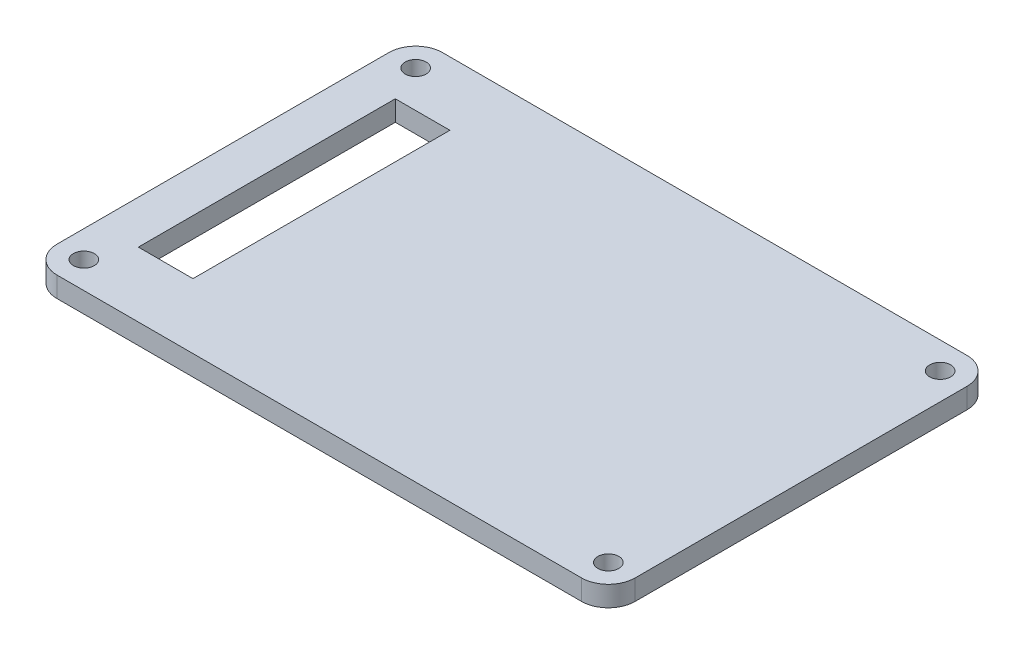
ISO-10303-21;
HEADER;
FILE_DESCRIPTION(('STEP AP214'),'2;1');
FILE_NAME('part.step','',(''),(''),'','','');
FILE_SCHEMA(('AUTOMOTIVE_DESIGN { 1 0 10303 214 1 1 1 1 }'));
ENDSEC;
DATA;
#1=APPLICATION_CONTEXT('core data for automotive mechanical design processes');
#2=APPLICATION_PROTOCOL_DEFINITION('international standard','automotive_design',2000,#1);
#3=PRODUCT_CONTEXT('',#1,'mechanical');
#4=PRODUCT('Part','Part','',(#3));
#5=PRODUCT_RELATED_PRODUCT_CATEGORY('part','',(#4));
#6=PRODUCT_DEFINITION_FORMATION('','',#4);
#7=PRODUCT_DEFINITION_CONTEXT('part definition',#1,'design');
#8=PRODUCT_DEFINITION('design','',#6,#7);
#9=PRODUCT_DEFINITION_SHAPE('','',#8);
#10=(LENGTH_UNIT() NAMED_UNIT(*) SI_UNIT(.MILLI.,.METRE.));
#11=(NAMED_UNIT(*) PLANE_ANGLE_UNIT() SI_UNIT($,.RADIAN.));
#12=(NAMED_UNIT(*) SI_UNIT($,.STERADIAN.) SOLID_ANGLE_UNIT());
#13=UNCERTAINTY_MEASURE_WITH_UNIT(LENGTH_MEASURE(1.E-05),#10,'distance_accuracy_value','');
#14=(GEOMETRIC_REPRESENTATION_CONTEXT(3) GLOBAL_UNCERTAINTY_ASSIGNED_CONTEXT((#13)) GLOBAL_UNIT_ASSIGNED_CONTEXT((#10,
#11,#12)) REPRESENTATION_CONTEXT('',''));
#15=CARTESIAN_POINT('',(0.,0.,0.));
#16=DIRECTION('',(0.,0.,1.));
#17=DIRECTION('',(1.,0.,0.));
#18=AXIS2_PLACEMENT_3D('',#15,#16,#17);
#19=CARTESIAN_POINT('',(-40.825,3.175,-25.825));
#20=DIRECTION('',(0.,1.,0.));
#21=DIRECTION('',(0.,0.,1.));
#22=AXIS2_PLACEMENT_3D('',#19,#20,#21);
#23=PLANE('',#22);
#24=DIRECTION('',(1.,0.,0.));
#25=VECTOR('',#24,1.);
#26=CARTESIAN_POINT('',(-38.2653138076385,3.175,19.9));
#27=LINE('',#26,#25);
#28=CARTESIAN_POINT('',(-38.2653138076385,3.175,19.9));
#29=VERTEX_POINT('',#28);
#30=CARTESIAN_POINT('',(-29.7653138076385,3.175,19.9));
#31=VERTEX_POINT('',#30);
#32=EDGE_CURVE('E48',#29,#31,#27,.T.);
#33=ORIENTED_EDGE('',*,*,#32,.F.);
#34=DIRECTION('',(0.,0.,1.));
#35=VECTOR('',#34,1.);
#36=CARTESIAN_POINT('',(-38.2653138076385,3.175,-20.1));
#37=LINE('',#36,#35);
#38=CARTESIAN_POINT('',(-38.2653138076385,3.175,-20.1));
#39=VERTEX_POINT('',#38);
#40=EDGE_CURVE('E140',#39,#29,#37,.T.);
#41=ORIENTED_EDGE('',*,*,#40,.F.);
#42=DIRECTION('',(-1.,0.,0.));
#43=VECTOR('',#42,1.);
#44=CARTESIAN_POINT('',(-29.7653138076385,3.175,-20.1));
#45=LINE('',#44,#43);
#46=CARTESIAN_POINT('',(-29.7653138076385,3.175,-20.1));
#47=VERTEX_POINT('',#46);
#48=EDGE_CURVE('E143',#47,#39,#45,.T.);
#49=ORIENTED_EDGE('',*,*,#48,.F.);
#50=DIRECTION('',(0.,0.,-1.));
#51=VECTOR('',#50,1.);
#52=CARTESIAN_POINT('',(-29.7653138076385,3.175,19.9));
#53=LINE('',#52,#51);
#54=EDGE_CURVE('E149',#31,#47,#53,.T.);
#55=ORIENTED_EDGE('',*,*,#54,.F.);
#56=EDGE_LOOP('',(#33,#41,#49,#55));
#57=FACE_BOUND('',#56,.T.);
#58=CARTESIAN_POINT('',(-40.825,3.175,-25.825));
#59=DIRECTION('',(0.,1.,0.));
#60=DIRECTION('',(0.,0.,1.));
#61=AXIS2_PLACEMENT_3D('',#58,#59,#60);
#62=CIRCLE('',#61,1.63195);
#63=CARTESIAN_POINT('',(-40.825,3.175,-24.19305));
#64=VERTEX_POINT('',#63);
#65=EDGE_CURVE('E165',#64,#64,#62,.T.);
#66=ORIENTED_EDGE('',*,*,#65,.F.);
#67=EDGE_LOOP('',(#66));
#68=FACE_BOUND('',#67,.T.);
#69=CARTESIAN_POINT('',(40.825,3.175,-25.825));
#70=DIRECTION('',(0.,1.,0.));
#71=DIRECTION('',(0.,0.,1.));
#72=AXIS2_PLACEMENT_3D('',#69,#70,#71);
#73=CIRCLE('',#72,1.63195);
#74=CARTESIAN_POINT('',(40.825,3.175,-24.19305));
#75=VERTEX_POINT('',#74);
#76=EDGE_CURVE('E177',#75,#75,#73,.T.);
#77=ORIENTED_EDGE('',*,*,#76,.F.);
#78=EDGE_LOOP('',(#77));
#79=FACE_BOUND('',#78,.T.);
#80=CARTESIAN_POINT('',(-40.825,3.175,-25.825));
#81=DIRECTION('',(0.,1.,0.));
#82=DIRECTION('',(0.,0.,1.));
#83=AXIS2_PLACEMENT_3D('',#80,#81,#82);
#84=CIRCLE('',#83,4.17499999999999);
#85=CARTESIAN_POINT('',(-40.825,3.175,-30.));
#86=VERTEX_POINT('',#85);
#87=CARTESIAN_POINT('',(-45.,3.175,-25.825));
#88=VERTEX_POINT('',#87);
#89=EDGE_CURVE('E183',#86,#88,#84,.T.);
#90=ORIENTED_EDGE('',*,*,#89,.T.);
#91=DIRECTION('',(0.,0.,1.));
#92=VECTOR('',#91,1.);
#93=CARTESIAN_POINT('',(-45.,3.175,-25.825));
#94=LINE('',#93,#92);
#95=CARTESIAN_POINT('',(-45.,3.175,25.825));
#96=VERTEX_POINT('',#95);
#97=EDGE_CURVE('E186',#88,#96,#94,.T.);
#98=ORIENTED_EDGE('',*,*,#97,.T.);
#99=CARTESIAN_POINT('',(-40.825,3.175,25.825));
#100=DIRECTION('',(0.,1.,0.));
#101=DIRECTION('',(0.,0.,1.));
#102=AXIS2_PLACEMENT_3D('',#99,#100,#101);
#103=CIRCLE('',#102,4.17500000000001);
#104=CARTESIAN_POINT('',(-40.825,3.175,30.));
#105=VERTEX_POINT('',#104);
#106=EDGE_CURVE('E189',#96,#105,#103,.T.);
#107=ORIENTED_EDGE('',*,*,#106,.T.);
#108=DIRECTION('',(1.,0.,0.));
#109=VECTOR('',#108,1.);
#110=CARTESIAN_POINT('',(-40.825,3.175,30.));
#111=LINE('',#110,#109);
#112=CARTESIAN_POINT('',(40.825,3.175,30.));
#113=VERTEX_POINT('',#112);
#114=EDGE_CURVE('E191',#105,#113,#111,.T.);
#115=ORIENTED_EDGE('',*,*,#114,.T.);
#116=CARTESIAN_POINT('',(40.825,3.175,25.825));
#117=DIRECTION('',(0.,1.,0.));
#118=DIRECTION('',(0.,0.,1.));
#119=AXIS2_PLACEMENT_3D('',#116,#117,#118);
#120=CIRCLE('',#119,4.17499999999999);
#121=CARTESIAN_POINT('',(45.,3.175,25.825));
#122=VERTEX_POINT('',#121);
#123=EDGE_CURVE('E193',#113,#122,#120,.T.);
#124=ORIENTED_EDGE('',*,*,#123,.T.);
#125=DIRECTION('',(0.,0.,-1.));
#126=VECTOR('',#125,1.);
#127=CARTESIAN_POINT('',(45.,3.175,-25.825));
#128=LINE('',#127,#126);
#129=CARTESIAN_POINT('',(45.,3.175,-25.825));
#130=VERTEX_POINT('',#129);
#131=EDGE_CURVE('E195',#122,#130,#128,.T.);
#132=ORIENTED_EDGE('',*,*,#131,.T.);
#133=CARTESIAN_POINT('',(40.825,3.175,-25.825));
#134=DIRECTION('',(0.,1.,0.));
#135=DIRECTION('',(0.,0.,1.));
#136=AXIS2_PLACEMENT_3D('',#133,#134,#135);
#137=CIRCLE('',#136,4.175);
#138=CARTESIAN_POINT('',(40.825,3.175,-30.));
#139=VERTEX_POINT('',#138);
#140=EDGE_CURVE('E197',#130,#139,#137,.T.);
#141=ORIENTED_EDGE('',*,*,#140,.T.);
#142=DIRECTION('',(-1.,0.,0.));
#143=VECTOR('',#142,1.);
#144=CARTESIAN_POINT('',(-40.825,3.175,-30.));
#145=LINE('',#144,#143);
#146=EDGE_CURVE('E199',#139,#86,#145,.T.);
#147=ORIENTED_EDGE('',*,*,#146,.T.);
#148=EDGE_LOOP('',(#90,#98,#107,#115,#124,#132,#141,#147));
#149=FACE_BOUND('',#148,.T.);
#150=CARTESIAN_POINT('',(40.825,3.175,25.825));
#151=DIRECTION('',(0.,1.,0.));
#152=DIRECTION('',(0.,0.,1.));
#153=AXIS2_PLACEMENT_3D('',#150,#151,#152);
#154=CIRCLE('',#153,1.63195);
#155=CARTESIAN_POINT('',(40.825,3.175,27.45695));
#156=VERTEX_POINT('',#155);
#157=EDGE_CURVE('E171',#156,#156,#154,.T.);
#158=ORIENTED_EDGE('',*,*,#157,.F.);
#159=EDGE_LOOP('',(#158));
#160=FACE_BOUND('',#159,.T.);
#161=CARTESIAN_POINT('',(-40.825,3.175,25.825));
#162=DIRECTION('',(0.,1.,0.));
#163=DIRECTION('',(0.,0.,1.));
#164=AXIS2_PLACEMENT_3D('',#161,#162,#163);
#165=CIRCLE('',#164,1.63195);
#166=CARTESIAN_POINT('',(-40.825,3.175,27.45695));
#167=VERTEX_POINT('',#166);
#168=EDGE_CURVE('E159',#167,#167,#165,.T.);
#169=ORIENTED_EDGE('',*,*,#168,.F.);
#170=EDGE_LOOP('',(#169));
#171=FACE_BOUND('',#170,.T.);
#172=ADVANCED_FACE('F33',(#57,#68,#79,#149,#160,#171),#23,.T.);
#173=CARTESIAN_POINT('',(-40.825,0.,-25.825));
#174=DIRECTION('',(0.,1.,0.));
#175=DIRECTION('',(0.,0.,1.));
#176=AXIS2_PLACEMENT_3D('',#173,#174,#175);
#177=PLANE('',#176);
#178=DIRECTION('',(0.,0.,1.));
#179=VECTOR('',#178,1.);
#180=CARTESIAN_POINT('',(-38.2653138076385,0.,-20.1));
#181=LINE('',#180,#179);
#182=CARTESIAN_POINT('',(-38.2653138076385,0.,-20.1));
#183=VERTEX_POINT('',#182);
#184=CARTESIAN_POINT('',(-38.2653138076385,0.,19.9));
#185=VERTEX_POINT('',#184);
#186=EDGE_CURVE('E130',#183,#185,#181,.T.);
#187=ORIENTED_EDGE('',*,*,#186,.T.);
#188=DIRECTION('',(1.,0.,0.));
#189=VECTOR('',#188,1.);
#190=CARTESIAN_POINT('',(-38.2653138076385,0.,19.9));
#191=LINE('',#190,#189);
#192=CARTESIAN_POINT('',(-29.7653138076385,0.,19.9));
#193=VERTEX_POINT('',#192);
#194=EDGE_CURVE('E124',#185,#193,#191,.T.);
#195=ORIENTED_EDGE('',*,*,#194,.T.);
#196=DIRECTION('',(0.,0.,-1.));
#197=VECTOR('',#196,1.);
#198=CARTESIAN_POINT('',(-29.7653138076385,0.,19.9));
#199=LINE('',#198,#197);
#200=CARTESIAN_POINT('',(-29.7653138076385,0.,-20.1));
#201=VERTEX_POINT('',#200);
#202=EDGE_CURVE('E133',#193,#201,#199,.T.);
#203=ORIENTED_EDGE('',*,*,#202,.T.);
#204=DIRECTION('',(-1.,0.,0.));
#205=VECTOR('',#204,1.);
#206=CARTESIAN_POINT('',(-29.7653138076385,0.,-20.1));
#207=LINE('',#206,#205);
#208=EDGE_CURVE('E56',#201,#183,#207,.T.);
#209=ORIENTED_EDGE('',*,*,#208,.T.);
#210=EDGE_LOOP('',(#187,#195,#203,#209));
#211=FACE_BOUND('',#210,.T.);
#212=CARTESIAN_POINT('',(-40.825,0.,-25.825));
#213=DIRECTION('',(0.,1.,0.));
#214=DIRECTION('',(0.,0.,1.));
#215=AXIS2_PLACEMENT_3D('',#212,#213,#214);
#216=CIRCLE('',#215,4.17499999999999);
#217=CARTESIAN_POINT('',(-40.825,0.,-30.));
#218=VERTEX_POINT('',#217);
#219=CARTESIAN_POINT('',(-45.,0.,-25.825));
#220=VERTEX_POINT('',#219);
#221=EDGE_CURVE('E180',#218,#220,#216,.T.);
#222=ORIENTED_EDGE('',*,*,#221,.F.);
#223=DIRECTION('',(-1.,0.,0.));
#224=VECTOR('',#223,1.);
#225=CARTESIAN_POINT('',(-40.825,0.,-30.));
#226=LINE('',#225,#224);
#227=CARTESIAN_POINT('',(40.825,0.,-30.));
#228=VERTEX_POINT('',#227);
#229=EDGE_CURVE('E187',#228,#218,#226,.T.);
#230=ORIENTED_EDGE('',*,*,#229,.F.);
#231=CARTESIAN_POINT('',(40.825,0.,-25.825));
#232=DIRECTION('',(0.,1.,0.));
#233=DIRECTION('',(0.,0.,1.));
#234=AXIS2_PLACEMENT_3D('',#231,#232,#233);
#235=CIRCLE('',#234,4.175);
#236=CARTESIAN_POINT('',(45.,0.,-25.825));
#237=VERTEX_POINT('',#236);
#238=EDGE_CURVE('E214',#237,#228,#235,.T.);
#239=ORIENTED_EDGE('',*,*,#238,.F.);
#240=DIRECTION('',(0.,0.,-1.));
#241=VECTOR('',#240,1.);
#242=CARTESIAN_POINT('',(45.,0.,-25.825));
#243=LINE('',#242,#241);
#244=CARTESIAN_POINT('',(45.,0.,25.825));
#245=VERTEX_POINT('',#244);
#246=EDGE_CURVE('E212',#245,#237,#243,.T.);
#247=ORIENTED_EDGE('',*,*,#246,.F.);
#248=CARTESIAN_POINT('',(40.825,0.,25.825));
#249=DIRECTION('',(0.,1.,0.));
#250=DIRECTION('',(0.,0.,1.));
#251=AXIS2_PLACEMENT_3D('',#248,#249,#250);
#252=CIRCLE('',#251,4.17499999999999);
#253=CARTESIAN_POINT('',(40.825,0.,30.));
#254=VERTEX_POINT('',#253);
#255=EDGE_CURVE('E210',#254,#245,#252,.T.);
#256=ORIENTED_EDGE('',*,*,#255,.F.);
#257=DIRECTION('',(1.,0.,0.));
#258=VECTOR('',#257,1.);
#259=CARTESIAN_POINT('',(-40.825,0.,30.));
#260=LINE('',#259,#258);
#261=CARTESIAN_POINT('',(-40.825,0.,30.));
#262=VERTEX_POINT('',#261);
#263=EDGE_CURVE('E208',#262,#254,#260,.T.);
#264=ORIENTED_EDGE('',*,*,#263,.F.);
#265=CARTESIAN_POINT('',(-40.825,0.,25.825));
#266=DIRECTION('',(0.,1.,0.));
#267=DIRECTION('',(0.,0.,1.));
#268=AXIS2_PLACEMENT_3D('',#265,#266,#267);
#269=CIRCLE('',#268,4.17500000000001);
#270=CARTESIAN_POINT('',(-45.,0.,25.825));
#271=VERTEX_POINT('',#270);
#272=EDGE_CURVE('E206',#271,#262,#269,.T.);
#273=ORIENTED_EDGE('',*,*,#272,.F.);
#274=DIRECTION('',(0.,0.,1.));
#275=VECTOR('',#274,1.);
#276=CARTESIAN_POINT('',(-45.,0.,-25.825));
#277=LINE('',#276,#275);
#278=EDGE_CURVE('E204',#220,#271,#277,.T.);
#279=ORIENTED_EDGE('',*,*,#278,.F.);
#280=EDGE_LOOP('',(#222,#230,#239,#247,#256,#264,#273,#279));
#281=FACE_BOUND('',#280,.T.);
#282=CARTESIAN_POINT('',(40.825,0.,-25.825));
#283=DIRECTION('',(0.,1.,0.));
#284=DIRECTION('',(0.,0.,1.));
#285=AXIS2_PLACEMENT_3D('',#282,#283,#284);
#286=CIRCLE('',#285,1.63195);
#287=CARTESIAN_POINT('',(40.825,0.,-24.19305));
#288=VERTEX_POINT('',#287);
#289=EDGE_CURVE('E174',#288,#288,#286,.T.);
#290=ORIENTED_EDGE('',*,*,#289,.T.);
#291=EDGE_LOOP('',(#290));
#292=FACE_BOUND('',#291,.T.);
#293=CARTESIAN_POINT('',(40.825,0.,25.825));
#294=DIRECTION('',(0.,1.,0.));
#295=DIRECTION('',(0.,0.,1.));
#296=AXIS2_PLACEMENT_3D('',#293,#294,#295);
#297=CIRCLE('',#296,1.63195);
#298=CARTESIAN_POINT('',(40.825,0.,27.45695));
#299=VERTEX_POINT('',#298);
#300=EDGE_CURVE('E168',#299,#299,#297,.T.);
#301=ORIENTED_EDGE('',*,*,#300,.T.);
#302=EDGE_LOOP('',(#301));
#303=FACE_BOUND('',#302,.T.);
#304=CARTESIAN_POINT('',(-40.825,0.,-25.825));
#305=DIRECTION('',(0.,1.,0.));
#306=DIRECTION('',(0.,0.,1.));
#307=AXIS2_PLACEMENT_3D('',#304,#305,#306);
#308=CIRCLE('',#307,1.63195);
#309=CARTESIAN_POINT('',(-40.825,0.,-24.19305));
#310=VERTEX_POINT('',#309);
#311=EDGE_CURVE('E162',#310,#310,#308,.T.);
#312=ORIENTED_EDGE('',*,*,#311,.T.);
#313=EDGE_LOOP('',(#312));
#314=FACE_BOUND('',#313,.T.);
#315=CARTESIAN_POINT('',(-40.825,0.,25.825));
#316=DIRECTION('',(0.,1.,0.));
#317=DIRECTION('',(0.,0.,1.));
#318=AXIS2_PLACEMENT_3D('',#315,#316,#317);
#319=CIRCLE('',#318,1.63195);
#320=CARTESIAN_POINT('',(-40.825,0.,27.45695));
#321=VERTEX_POINT('',#320);
#322=EDGE_CURVE('E155',#321,#321,#319,.T.);
#323=ORIENTED_EDGE('',*,*,#322,.T.);
#324=EDGE_LOOP('',(#323));
#325=FACE_BOUND('',#324,.T.);
#326=ADVANCED_FACE('F137',(#211,#281,#292,#303,#314,#325),#177,.F.);
#327=CARTESIAN_POINT('',(-40.825,3.175,-25.825));
#328=DIRECTION('',(0.,-1.,0.));
#329=DIRECTION('',(0.,0.,-1.));
#330=AXIS2_PLACEMENT_3D('',#327,#328,#329);
#331=CYLINDRICAL_SURFACE('',#330,4.17499999999999);
#332=ORIENTED_EDGE('',*,*,#221,.T.);
#333=DIRECTION('',(0.,-1.,0.));
#334=VECTOR('',#333,1.);
#335=CARTESIAN_POINT('',(-45.,3.175,-25.825));
#336=LINE('',#335,#334);
#337=EDGE_CURVE('E11',#88,#220,#336,.T.);
#338=ORIENTED_EDGE('',*,*,#337,.F.);
#339=ORIENTED_EDGE('',*,*,#89,.F.);
#340=DIRECTION('',(0.,-1.,0.));
#341=VECTOR('',#340,1.);
#342=CARTESIAN_POINT('',(-40.825,3.175,-30.));
#343=LINE('',#342,#341);
#344=EDGE_CURVE('E201',#86,#218,#343,.T.);
#345=ORIENTED_EDGE('',*,*,#344,.T.);
#346=EDGE_LOOP('',(#332,#338,#339,#345));
#347=FACE_BOUND('',#346,.T.);
#348=ADVANCED_FACE('F35',(#347),#331,.T.);
#349=CARTESIAN_POINT('',(-45.,3.175,-25.825));
#350=DIRECTION('',(1.,0.,0.));
#351=DIRECTION('',(0.,0.,-1.));
#352=AXIS2_PLACEMENT_3D('',#349,#350,#351);
#353=PLANE('',#352);
#354=ORIENTED_EDGE('',*,*,#278,.T.);
#355=DIRECTION('',(0.,-1.,0.));
#356=VECTOR('',#355,1.);
#357=CARTESIAN_POINT('',(-45.,3.175,25.825));
#358=LINE('',#357,#356);
#359=EDGE_CURVE('E41',#96,#271,#358,.T.);
#360=ORIENTED_EDGE('',*,*,#359,.F.);
#361=ORIENTED_EDGE('',*,*,#97,.F.);
#362=ORIENTED_EDGE('',*,*,#337,.T.);
#363=EDGE_LOOP('',(#354,#360,#361,#362));
#364=FACE_BOUND('',#363,.T.);
#365=ADVANCED_FACE('F260',(#364),#353,.F.);
#366=CARTESIAN_POINT('',(-40.825,3.175,25.825));
#367=DIRECTION('',(0.,-1.,0.));
#368=DIRECTION('',(0.,0.,-1.));
#369=AXIS2_PLACEMENT_3D('',#366,#367,#368);
#370=CYLINDRICAL_SURFACE('',#369,4.17500000000001);
#371=ORIENTED_EDGE('',*,*,#272,.T.);
#372=DIRECTION('',(0.,-1.,0.));
#373=VECTOR('',#372,1.);
#374=CARTESIAN_POINT('',(-40.825,3.175,30.));
#375=LINE('',#374,#373);
#376=EDGE_CURVE('E231',#105,#262,#375,.T.);
#377=ORIENTED_EDGE('',*,*,#376,.F.);
#378=ORIENTED_EDGE('',*,*,#106,.F.);
#379=ORIENTED_EDGE('',*,*,#359,.T.);
#380=EDGE_LOOP('',(#371,#377,#378,#379));
#381=FACE_BOUND('',#380,.T.);
#382=ADVANCED_FACE('F238',(#381),#370,.T.);
#383=CARTESIAN_POINT('',(-40.825,3.175,30.));
#384=DIRECTION('',(0.,0.,-1.));
#385=DIRECTION('',(-1.,0.,0.));
#386=AXIS2_PLACEMENT_3D('',#383,#384,#385);
#387=PLANE('',#386);
#388=ORIENTED_EDGE('',*,*,#263,.T.);
#389=DIRECTION('',(0.,-1.,0.));
#390=VECTOR('',#389,1.);
#391=CARTESIAN_POINT('',(40.825,3.175,30.));
#392=LINE('',#391,#390);
#393=EDGE_CURVE('E228',#113,#254,#392,.T.);
#394=ORIENTED_EDGE('',*,*,#393,.F.);
#395=ORIENTED_EDGE('',*,*,#114,.F.);
#396=ORIENTED_EDGE('',*,*,#376,.T.);
#397=EDGE_LOOP('',(#388,#394,#395,#396));
#398=FACE_BOUND('',#397,.T.);
#399=ADVANCED_FACE('F248',(#398),#387,.F.);
#400=CARTESIAN_POINT('',(40.825,3.175,25.825));
#401=DIRECTION('',(0.,-1.,0.));
#402=DIRECTION('',(0.,0.,-1.));
#403=AXIS2_PLACEMENT_3D('',#400,#401,#402);
#404=CYLINDRICAL_SURFACE('',#403,4.17499999999999);
#405=ORIENTED_EDGE('',*,*,#255,.T.);
#406=DIRECTION('',(0.,-1.,0.));
#407=VECTOR('',#406,1.);
#408=CARTESIAN_POINT('',(45.,3.175,25.825));
#409=LINE('',#408,#407);
#410=EDGE_CURVE('E225',#122,#245,#409,.T.);
#411=ORIENTED_EDGE('',*,*,#410,.F.);
#412=ORIENTED_EDGE('',*,*,#123,.F.);
#413=ORIENTED_EDGE('',*,*,#393,.T.);
#414=EDGE_LOOP('',(#405,#411,#412,#413));
#415=FACE_BOUND('',#414,.T.);
#416=ADVANCED_FACE('F252',(#415),#404,.T.);
#417=CARTESIAN_POINT('',(45.,3.175,-25.825));
#418=DIRECTION('',(-1.,0.,0.));
#419=DIRECTION('',(0.,0.,1.));
#420=AXIS2_PLACEMENT_3D('',#417,#418,#419);
#421=PLANE('',#420);
#422=ORIENTED_EDGE('',*,*,#246,.T.);
#423=DIRECTION('',(0.,-1.,0.));
#424=VECTOR('',#423,1.);
#425=CARTESIAN_POINT('',(45.,3.175,-25.825));
#426=LINE('',#425,#424);
#427=EDGE_CURVE('E222',#130,#237,#426,.T.);
#428=ORIENTED_EDGE('',*,*,#427,.F.);
#429=ORIENTED_EDGE('',*,*,#131,.F.);
#430=ORIENTED_EDGE('',*,*,#410,.T.);
#431=EDGE_LOOP('',(#422,#428,#429,#430));
#432=FACE_BOUND('',#431,.T.);
#433=ADVANCED_FACE('F273',(#432),#421,.F.);
#434=CARTESIAN_POINT('',(40.825,3.175,-25.825));
#435=DIRECTION('',(0.,-1.,0.));
#436=DIRECTION('',(0.,0.,-1.));
#437=AXIS2_PLACEMENT_3D('',#434,#435,#436);
#438=CYLINDRICAL_SURFACE('',#437,4.175);
#439=ORIENTED_EDGE('',*,*,#238,.T.);
#440=DIRECTION('',(0.,-1.,0.));
#441=VECTOR('',#440,1.);
#442=CARTESIAN_POINT('',(40.825,3.175,-30.));
#443=LINE('',#442,#441);
#444=EDGE_CURVE('E219',#139,#228,#443,.T.);
#445=ORIENTED_EDGE('',*,*,#444,.F.);
#446=ORIENTED_EDGE('',*,*,#140,.F.);
#447=ORIENTED_EDGE('',*,*,#427,.T.);
#448=EDGE_LOOP('',(#439,#445,#446,#447));
#449=FACE_BOUND('',#448,.T.);
#450=ADVANCED_FACE('F271',(#449),#438,.T.);
#451=CARTESIAN_POINT('',(-40.825,3.175,-30.));
#452=DIRECTION('',(0.,0.,1.));
#453=DIRECTION('',(1.,0.,0.));
#454=AXIS2_PLACEMENT_3D('',#451,#452,#453);
#455=PLANE('',#454);
#456=ORIENTED_EDGE('',*,*,#229,.T.);
#457=ORIENTED_EDGE('',*,*,#344,.F.);
#458=ORIENTED_EDGE('',*,*,#146,.F.);
#459=ORIENTED_EDGE('',*,*,#444,.T.);
#460=EDGE_LOOP('',(#456,#457,#458,#459));
#461=FACE_BOUND('',#460,.T.);
#462=ADVANCED_FACE('F266',(#461),#455,.F.);
#463=CARTESIAN_POINT('',(40.825,3.175,-25.825));
#464=DIRECTION('',(0.,-1.,0.));
#465=DIRECTION('',(0.,0.,-1.));
#466=AXIS2_PLACEMENT_3D('',#463,#464,#465);
#467=CYLINDRICAL_SURFACE('',#466,1.63195);
#468=ORIENTED_EDGE('',*,*,#76,.T.);
#469=EDGE_LOOP('',(#468));
#470=FACE_BOUND('',#469,.T.);
#471=ORIENTED_EDGE('',*,*,#289,.F.);
#472=EDGE_LOOP('',(#471));
#473=FACE_BOUND('',#472,.T.);
#474=ADVANCED_FACE('F291',(#470,#473),#467,.F.);
#475=CARTESIAN_POINT('',(40.825,3.175,25.825));
#476=DIRECTION('',(0.,-1.,0.));
#477=DIRECTION('',(0.,0.,-1.));
#478=AXIS2_PLACEMENT_3D('',#475,#476,#477);
#479=CYLINDRICAL_SURFACE('',#478,1.63195);
#480=ORIENTED_EDGE('',*,*,#157,.T.);
#481=EDGE_LOOP('',(#480));
#482=FACE_BOUND('',#481,.T.);
#483=ORIENTED_EDGE('',*,*,#300,.F.);
#484=EDGE_LOOP('',(#483));
#485=FACE_BOUND('',#484,.T.);
#486=ADVANCED_FACE('F298',(#482,#485),#479,.F.);
#487=CARTESIAN_POINT('',(-40.825,3.175,-25.825));
#488=DIRECTION('',(0.,-1.,0.));
#489=DIRECTION('',(0.,0.,-1.));
#490=AXIS2_PLACEMENT_3D('',#487,#488,#489);
#491=CYLINDRICAL_SURFACE('',#490,1.63195);
#492=ORIENTED_EDGE('',*,*,#65,.T.);
#493=EDGE_LOOP('',(#492));
#494=FACE_BOUND('',#493,.T.);
#495=ORIENTED_EDGE('',*,*,#311,.F.);
#496=EDGE_LOOP('',(#495));
#497=FACE_BOUND('',#496,.T.);
#498=ADVANCED_FACE('F303',(#494,#497),#491,.F.);
#499=CARTESIAN_POINT('',(-40.825,3.175,25.825));
#500=DIRECTION('',(0.,-1.,0.));
#501=DIRECTION('',(0.,0.,-1.));
#502=AXIS2_PLACEMENT_3D('',#499,#500,#501);
#503=CYLINDRICAL_SURFACE('',#502,1.63195);
#504=ORIENTED_EDGE('',*,*,#168,.T.);
#505=EDGE_LOOP('',(#504));
#506=FACE_BOUND('',#505,.T.);
#507=ORIENTED_EDGE('',*,*,#322,.F.);
#508=EDGE_LOOP('',(#507));
#509=FACE_BOUND('',#508,.T.);
#510=ADVANCED_FACE('F315',(#506,#509),#503,.F.);
#511=CARTESIAN_POINT('',(-38.2653138076385,0.,19.9));
#512=DIRECTION('',(0.,0.,1.));
#513=DIRECTION('',(1.,0.,0.));
#514=AXIS2_PLACEMENT_3D('',#511,#512,#513);
#515=PLANE('',#514);
#516=ORIENTED_EDGE('',*,*,#32,.T.);
#517=DIRECTION('',(0.,1.,0.));
#518=VECTOR('',#517,1.);
#519=CARTESIAN_POINT('',(-29.7653138076385,0.,19.9));
#520=LINE('',#519,#518);
#521=EDGE_CURVE('E120',#193,#31,#520,.T.);
#522=ORIENTED_EDGE('',*,*,#521,.F.);
#523=ORIENTED_EDGE('',*,*,#194,.F.);
#524=DIRECTION('',(0.,1.,0.));
#525=VECTOR('',#524,1.);
#526=CARTESIAN_POINT('',(-38.2653138076385,0.,19.9));
#527=LINE('',#526,#525);
#528=EDGE_CURVE('E153',#185,#29,#527,.T.);
#529=ORIENTED_EDGE('',*,*,#528,.T.);
#530=EDGE_LOOP('',(#516,#522,#523,#529));
#531=FACE_BOUND('',#530,.T.);
#532=ADVANCED_FACE('F122',(#531),#515,.F.);
#533=CARTESIAN_POINT('',(-38.2653138076385,0.,-20.1));
#534=DIRECTION('',(-1.,0.,0.));
#535=DIRECTION('',(0.,0.,1.));
#536=AXIS2_PLACEMENT_3D('',#533,#534,#535);
#537=PLANE('',#536);
#538=ORIENTED_EDGE('',*,*,#40,.T.);
#539=ORIENTED_EDGE('',*,*,#528,.F.);
#540=ORIENTED_EDGE('',*,*,#186,.F.);
#541=DIRECTION('',(0.,1.,0.));
#542=VECTOR('',#541,1.);
#543=CARTESIAN_POINT('',(-38.2653138076385,0.,-20.1));
#544=LINE('',#543,#542);
#545=EDGE_CURVE('E156',#183,#39,#544,.T.);
#546=ORIENTED_EDGE('',*,*,#545,.T.);
#547=EDGE_LOOP('',(#538,#539,#540,#546));
#548=FACE_BOUND('',#547,.T.);
#549=ADVANCED_FACE('F323',(#548),#537,.F.);
#550=CARTESIAN_POINT('',(-29.7653138076385,0.,-20.1));
#551=DIRECTION('',(0.,0.,-1.));
#552=DIRECTION('',(-1.,0.,0.));
#553=AXIS2_PLACEMENT_3D('',#550,#551,#552);
#554=PLANE('',#553);
#555=ORIENTED_EDGE('',*,*,#48,.T.);
#556=ORIENTED_EDGE('',*,*,#545,.F.);
#557=ORIENTED_EDGE('',*,*,#208,.F.);
#558=DIRECTION('',(0.,1.,0.));
#559=VECTOR('',#558,1.);
#560=CARTESIAN_POINT('',(-29.7653138076385,0.,-20.1));
#561=LINE('',#560,#559);
#562=EDGE_CURVE('E129',#201,#47,#561,.T.);
#563=ORIENTED_EDGE('',*,*,#562,.T.);
#564=EDGE_LOOP('',(#555,#556,#557,#563));
#565=FACE_BOUND('',#564,.T.);
#566=ADVANCED_FACE('F330',(#565),#554,.F.);
#567=CARTESIAN_POINT('',(-29.7653138076385,0.,19.9));
#568=DIRECTION('',(1.,0.,0.));
#569=DIRECTION('',(0.,0.,-1.));
#570=AXIS2_PLACEMENT_3D('',#567,#568,#569);
#571=PLANE('',#570);
#572=ORIENTED_EDGE('',*,*,#54,.T.);
#573=ORIENTED_EDGE('',*,*,#562,.F.);
#574=ORIENTED_EDGE('',*,*,#202,.F.);
#575=ORIENTED_EDGE('',*,*,#521,.T.);
#576=EDGE_LOOP('',(#572,#573,#574,#575));
#577=FACE_BOUND('',#576,.T.);
#578=ADVANCED_FACE('F134',(#577),#571,.F.);
#579=CLOSED_SHELL('',(#172,#326,#348,#365,#382,#399,#416,#433,#450,#462,#474,#486,#498,#510,
#532,#549,#566,#578));
#580=MANIFOLD_SOLID_BREP('B2',#579);
#581=ADVANCED_BREP_SHAPE_REPRESENTATION('',(#18,#580),#14);
#582=SHAPE_DEFINITION_REPRESENTATION(#9,#581);
ENDSEC;
END-ISO-10303-21;
